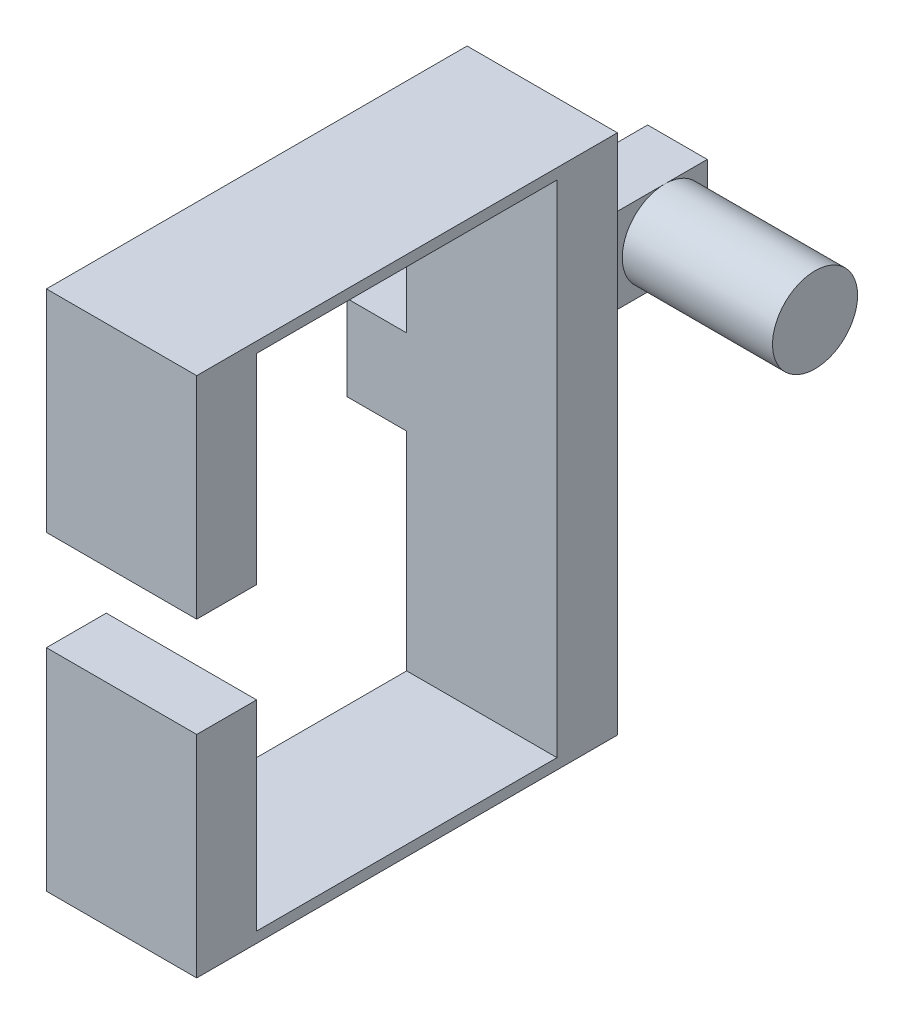
ISO-10303-21;
HEADER;
FILE_DESCRIPTION(('STEP AP214'),'2;1');
FILE_NAME('part.step','',(''),(''),'','','');
FILE_SCHEMA(('AUTOMOTIVE_DESIGN { 1 0 10303 214 1 1 1 1 }'));
ENDSEC;
DATA;
#1=APPLICATION_CONTEXT('core data for automotive mechanical design processes');
#2=APPLICATION_PROTOCOL_DEFINITION('international standard','automotive_design',2000,#1);
#3=PRODUCT_CONTEXT('',#1,'mechanical');
#4=PRODUCT('Part','Part','',(#3));
#5=PRODUCT_RELATED_PRODUCT_CATEGORY('part','',(#4));
#6=PRODUCT_DEFINITION_FORMATION('','',#4);
#7=PRODUCT_DEFINITION_CONTEXT('part definition',#1,'design');
#8=PRODUCT_DEFINITION('design','',#6,#7);
#9=PRODUCT_DEFINITION_SHAPE('','',#8);
#10=(LENGTH_UNIT() NAMED_UNIT(*) SI_UNIT(.MILLI.,.METRE.));
#11=(NAMED_UNIT(*) PLANE_ANGLE_UNIT() SI_UNIT($,.RADIAN.));
#12=(NAMED_UNIT(*) SI_UNIT($,.STERADIAN.) SOLID_ANGLE_UNIT());
#13=UNCERTAINTY_MEASURE_WITH_UNIT(LENGTH_MEASURE(1.E-05),#10,'distance_accuracy_value','');
#14=(GEOMETRIC_REPRESENTATION_CONTEXT(3) GLOBAL_UNCERTAINTY_ASSIGNED_CONTEXT((#13)) GLOBAL_UNIT_ASSIGNED_CONTEXT((#10,
#11,#12)) REPRESENTATION_CONTEXT('',''));
#15=CARTESIAN_POINT('',(0.,0.,0.));
#16=DIRECTION('',(0.,0.,1.));
#17=DIRECTION('',(1.,0.,0.));
#18=AXIS2_PLACEMENT_3D('',#15,#16,#17);
#19=CARTESIAN_POINT('',(0.,0.,0.));
#20=DIRECTION('',(-1.,0.,0.));
#21=DIRECTION('',(0.,0.,1.));
#22=AXIS2_PLACEMENT_3D('',#19,#20,#21);
#23=PLANE('',#22);
#24=CARTESIAN_POINT('',(0.,33.0589466598933,-25.0537044534588));
#25=DIRECTION('',(1.,0.,0.));
#26=DIRECTION('',(0.,0.,-1.));
#27=AXIS2_PLACEMENT_3D('',#24,#25,#26);
#28=CIRCLE('',#27,5.38878483418973);
#29=CARTESIAN_POINT('',(0.,33.0589466598933,-30.4424892876485));
#30=VERTEX_POINT('',#29);
#31=CARTESIAN_POINT('',(0.,38.4477314940831,-25.0537044534588));
#32=VERTEX_POINT('',#31);
#33=EDGE_CURVE('E194',#30,#32,#28,.T.);
#34=ORIENTED_EDGE('',*,*,#33,.F.);
#35=DIRECTION('',(0.,-1.,0.));
#36=VECTOR('',#35,1.);
#37=CARTESIAN_POINT('',(0.,38.4477314940831,-30.4424892876485));
#38=LINE('',#37,#36);
#39=CARTESIAN_POINT('',(0.,38.4477314940831,-30.4424892876485));
#40=VERTEX_POINT('',#39);
#41=EDGE_CURVE('E176',#40,#30,#38,.T.);
#42=ORIENTED_EDGE('',*,*,#41,.F.);
#43=DIRECTION('',(0.,0.,-1.));
#44=VECTOR('',#43,1.);
#45=CARTESIAN_POINT('',(0.,38.4477314940831,7.65751071235147));
#46=LINE('',#45,#44);
#47=EDGE_CURVE('E191',#32,#40,#46,.T.);
#48=ORIENTED_EDGE('',*,*,#47,.F.);
#49=EDGE_LOOP('',(#34,#42,#48));
#50=FACE_BOUND('',#49,.T.);
#51=ADVANCED_FACE('F44',(#50),#23,.F.);
#52=CARTESIAN_POINT('',(0.,27.6701618257036,-25.0537044534588));
#53=VERTEX_POINT('',#52);
#54=EDGE_CURVE('E63',#32,#53,#28,.T.);
#55=ORIENTED_EDGE('',*,*,#54,.F.);
#56=CARTESIAN_POINT('',(0.,38.4477314940831,0.));
#57=VERTEX_POINT('',#56);
#58=EDGE_CURVE('E213',#57,#32,#46,.T.);
#59=ORIENTED_EDGE('',*,*,#58,.F.);
#60=DIRECTION('',(0.,1.,0.));
#61=VECTOR('',#60,1.);
#62=CARTESIAN_POINT('',(0.,0.,0.));
#63=LINE('',#62,#61);
#64=CARTESIAN_POINT('',(0.,27.6701618257036,0.));
#65=VERTEX_POINT('',#64);
#66=EDGE_CURVE('E254',#65,#57,#63,.T.);
#67=ORIENTED_EDGE('',*,*,#66,.F.);
#68=DIRECTION('',(0.,0.,1.));
#69=VECTOR('',#68,1.);
#70=CARTESIAN_POINT('',(0.,27.6701618257036,7.65751071235147));
#71=LINE('',#70,#69);
#72=EDGE_CURVE('E57',#53,#65,#71,.T.);
#73=ORIENTED_EDGE('',*,*,#72,.F.);
#74=EDGE_LOOP('',(#55,#59,#67,#73));
#75=FACE_BOUND('',#74,.T.);
#76=ADVANCED_FACE('F374',(#75),#23,.F.);
#77=CARTESIAN_POINT('',(0.,0.,0.));
#78=DIRECTION('',(1.,0.,0.));
#79=DIRECTION('',(0.,0.,-1.));
#80=AXIS2_PLACEMENT_3D('',#77,#78,#79);
#81=PLANE('',#80);
#82=CARTESIAN_POINT('',(0.,38.4477314940831,7.65751071235147));
#83=VERTEX_POINT('',#82);
#84=EDGE_CURVE('E192',#83,#57,#46,.T.);
#85=ORIENTED_EDGE('',*,*,#84,.F.);
#86=DIRECTION('',(0.,-1.,0.));
#87=VECTOR('',#86,1.);
#88=CARTESIAN_POINT('',(0.,1.35466665989335,7.65751071235147));
#89=LINE('',#88,#87);
#90=CARTESIAN_POINT('',(0.,64.7632266598933,7.65751071235147));
#91=VERTEX_POINT('',#90);
#92=EDGE_CURVE('E266',#91,#83,#89,.T.);
#93=ORIENTED_EDGE('',*,*,#92,.F.);
#94=DIRECTION('',(0.,0.,-1.));
#95=VECTOR('',#94,1.);
#96=CARTESIAN_POINT('',(0.,64.7632266598933,45.7321107123515));
#97=LINE('',#96,#95);
#98=CARTESIAN_POINT('',(0.,64.7632266598933,45.7321107123515));
#99=VERTEX_POINT('',#98);
#100=EDGE_CURVE('E263',#99,#91,#97,.T.);
#101=ORIENTED_EDGE('',*,*,#100,.F.);
#102=DIRECTION('',(0.,1.,0.));
#103=VECTOR('',#102,1.);
#104=CARTESIAN_POINT('',(0.,39.3835466598933,45.7321107123515));
#105=LINE('',#104,#103);
#106=CARTESIAN_POINT('',(0.,39.3835466598933,45.7321107123515));
#107=VERTEX_POINT('',#106);
#108=EDGE_CURVE('E261',#107,#99,#105,.T.);
#109=ORIENTED_EDGE('',*,*,#108,.F.);
#110=DIRECTION('',(0.,0.,-1.));
#111=VECTOR('',#110,1.);
#112=CARTESIAN_POINT('',(0.,39.3835466598933,53.3205661447543));
#113=LINE('',#112,#111);
#114=CARTESIAN_POINT('',(0.,39.3835466598933,53.3205661447543));
#115=VERTEX_POINT('',#114);
#116=EDGE_CURVE('E259',#115,#107,#113,.T.);
#117=ORIENTED_EDGE('',*,*,#116,.F.);
#118=DIRECTION('',(0.,-1.,0.));
#119=VECTOR('',#118,1.);
#120=CARTESIAN_POINT('',(0.,66.1178933197867,53.3205661447543));
#121=LINE('',#120,#119);
#122=CARTESIAN_POINT('',(0.,66.1178933197867,53.3205661447543));
#123=VERTEX_POINT('',#122);
#124=EDGE_CURVE('E260',#123,#115,#121,.T.);
#125=ORIENTED_EDGE('',*,*,#124,.F.);
#126=DIRECTION('',(0.,0.,1.));
#127=VECTOR('',#126,1.);
#128=CARTESIAN_POINT('',(0.,66.1178933197867,0.));
#129=LINE('',#128,#127);
#130=CARTESIAN_POINT('',(0.,66.1178933197867,0.));
#131=VERTEX_POINT('',#130);
#132=EDGE_CURVE('E255',#131,#123,#129,.T.);
#133=ORIENTED_EDGE('',*,*,#132,.F.);
#134=EDGE_CURVE('E224',#57,#131,#63,.T.);
#135=ORIENTED_EDGE('',*,*,#134,.F.);
#136=EDGE_LOOP('',(#85,#93,#101,#109,#117,#125,#133,#135));
#137=FACE_BOUND('',#136,.T.);
#138=ADVANCED_FACE('F325',(#137),#81,.F.);
#139=CARTESIAN_POINT('',(0.,27.6701618257036,7.65751071235147));
#140=VERTEX_POINT('',#139);
#141=EDGE_CURVE('E11',#65,#140,#71,.T.);
#142=ORIENTED_EDGE('',*,*,#141,.F.);
#143=CARTESIAN_POINT('',(0.,0.,0.));
#144=VERTEX_POINT('',#143);
#145=EDGE_CURVE('E253',#144,#65,#63,.T.);
#146=ORIENTED_EDGE('',*,*,#145,.F.);
#147=DIRECTION('',(0.,0.,-1.));
#148=VECTOR('',#147,1.);
#149=CARTESIAN_POINT('',(0.,0.,0.));
#150=LINE('',#149,#148);
#151=CARTESIAN_POINT('',(0.,0.,53.3205661447543));
#152=VERTEX_POINT('',#151);
#153=EDGE_CURVE('E228',#152,#144,#150,.T.);
#154=ORIENTED_EDGE('',*,*,#153,.F.);
#155=DIRECTION('',(0.,-1.,0.));
#156=VECTOR('',#155,1.);
#157=CARTESIAN_POINT('',(0.,0.,53.3205661447543));
#158=LINE('',#157,#156);
#159=CARTESIAN_POINT('',(0.,26.7343466598933,53.3205661447543));
#160=VERTEX_POINT('',#159);
#161=EDGE_CURVE('E274',#160,#152,#158,.T.);
#162=ORIENTED_EDGE('',*,*,#161,.F.);
#163=DIRECTION('',(0.,0.,1.));
#164=VECTOR('',#163,1.);
#165=CARTESIAN_POINT('',(0.,26.7343466598933,53.3205661447543));
#166=LINE('',#165,#164);
#167=CARTESIAN_POINT('',(0.,26.7343466598933,45.7321107123515));
#168=VERTEX_POINT('',#167);
#169=EDGE_CURVE('E272',#168,#160,#166,.T.);
#170=ORIENTED_EDGE('',*,*,#169,.F.);
#171=DIRECTION('',(0.,1.,0.));
#172=VECTOR('',#171,1.);
#173=CARTESIAN_POINT('',(0.,26.7343466598933,45.7321107123515));
#174=LINE('',#173,#172);
#175=CARTESIAN_POINT('',(0.,1.35466665989334,45.7321107123515));
#176=VERTEX_POINT('',#175);
#177=EDGE_CURVE('E271',#176,#168,#174,.T.);
#178=ORIENTED_EDGE('',*,*,#177,.F.);
#179=DIRECTION('',(0.,0.,1.));
#180=VECTOR('',#179,1.);
#181=CARTESIAN_POINT('',(0.,1.35466665989334,45.7321107123515));
#182=LINE('',#181,#180);
#183=CARTESIAN_POINT('',(0.,1.35466665989335,7.65751071235147));
#184=VERTEX_POINT('',#183);
#185=EDGE_CURVE('E267',#184,#176,#182,.T.);
#186=ORIENTED_EDGE('',*,*,#185,.F.);
#187=EDGE_CURVE('E264',#140,#184,#89,.T.);
#188=ORIENTED_EDGE('',*,*,#187,.F.);
#189=EDGE_LOOP('',(#142,#146,#154,#162,#170,#178,#186,#188));
#190=FACE_BOUND('',#189,.T.);
#191=ADVANCED_FACE('F343',(#190),#81,.F.);
#192=CARTESIAN_POINT('',(19.05,0.,0.));
#193=DIRECTION('',(0.,0.,1.));
#194=DIRECTION('',(1.,0.,0.));
#195=AXIS2_PLACEMENT_3D('',#192,#193,#194);
#196=PLANE('',#195);
#197=ORIENTED_EDGE('',*,*,#145,.T.);
#198=ORIENTED_EDGE('',*,*,#66,.T.);
#199=ORIENTED_EDGE('',*,*,#134,.T.);
#200=DIRECTION('',(-1.,0.,0.));
#201=VECTOR('',#200,1.);
#202=CARTESIAN_POINT('',(19.05,66.1178933197867,0.));
#203=LINE('',#202,#201);
#204=CARTESIAN_POINT('',(19.05,66.1178933197867,0.));
#205=VERTEX_POINT('',#204);
#206=EDGE_CURVE('E47',#205,#131,#203,.T.);
#207=ORIENTED_EDGE('',*,*,#206,.F.);
#208=DIRECTION('',(0.,1.,0.));
#209=VECTOR('',#208,1.);
#210=CARTESIAN_POINT('',(19.05,0.,0.));
#211=LINE('',#210,#209);
#212=CARTESIAN_POINT('',(19.05,0.,0.));
#213=VERTEX_POINT('',#212);
#214=EDGE_CURVE('E221',#213,#205,#211,.T.);
#215=ORIENTED_EDGE('',*,*,#214,.F.);
#216=DIRECTION('',(-1.,0.,0.));
#217=VECTOR('',#216,1.);
#218=CARTESIAN_POINT('',(19.05,0.,0.));
#219=LINE('',#218,#217);
#220=EDGE_CURVE('E248',#213,#144,#219,.T.);
#221=ORIENTED_EDGE('',*,*,#220,.T.);
#222=EDGE_LOOP('',(#197,#198,#199,#207,#215,#221));
#223=FACE_BOUND('',#222,.T.);
#224=ADVANCED_FACE('F50',(#223),#196,.F.);
#225=CARTESIAN_POINT('',(19.05,66.1178933197867,0.));
#226=DIRECTION('',(0.,-1.,0.));
#227=DIRECTION('',(0.,0.,-1.));
#228=AXIS2_PLACEMENT_3D('',#225,#226,#227);
#229=PLANE('',#228);
#230=ORIENTED_EDGE('',*,*,#132,.T.);
#231=DIRECTION('',(-1.,0.,0.));
#232=VECTOR('',#231,1.);
#233=CARTESIAN_POINT('',(19.05,66.1178933197867,53.3205661447543));
#234=LINE('',#233,#232);
#235=CARTESIAN_POINT('',(19.05,66.1178933197867,53.3205661447543));
#236=VERTEX_POINT('',#235);
#237=EDGE_CURVE('E308',#236,#123,#234,.T.);
#238=ORIENTED_EDGE('',*,*,#237,.F.);
#239=DIRECTION('',(0.,0.,1.));
#240=VECTOR('',#239,1.);
#241=CARTESIAN_POINT('',(19.05,66.1178933197867,0.));
#242=LINE('',#241,#240);
#243=EDGE_CURVE('E230',#205,#236,#242,.T.);
#244=ORIENTED_EDGE('',*,*,#243,.F.);
#245=ORIENTED_EDGE('',*,*,#206,.T.);
#246=EDGE_LOOP('',(#230,#238,#244,#245));
#247=FACE_BOUND('',#246,.T.);
#248=ADVANCED_FACE('F312',(#247),#229,.F.);
#249=CARTESIAN_POINT('',(19.05,66.1178933197867,53.3205661447543));
#250=DIRECTION('',(0.,0.,-1.));
#251=DIRECTION('',(-1.,0.,0.));
#252=AXIS2_PLACEMENT_3D('',#249,#250,#251);
#253=PLANE('',#252);
#254=ORIENTED_EDGE('',*,*,#124,.T.);
#255=DIRECTION('',(-1.,0.,0.));
#256=VECTOR('',#255,1.);
#257=CARTESIAN_POINT('',(19.05,39.3835466598933,53.3205661447543));
#258=LINE('',#257,#256);
#259=CARTESIAN_POINT('',(19.05,39.3835466598933,53.3205661447543));
#260=VERTEX_POINT('',#259);
#261=EDGE_CURVE('E301',#260,#115,#258,.T.);
#262=ORIENTED_EDGE('',*,*,#261,.F.);
#263=DIRECTION('',(0.,-1.,0.));
#264=VECTOR('',#263,1.);
#265=CARTESIAN_POINT('',(19.05,66.1178933197867,53.3205661447543));
#266=LINE('',#265,#264);
#267=EDGE_CURVE('E226',#236,#260,#266,.T.);
#268=ORIENTED_EDGE('',*,*,#267,.F.);
#269=ORIENTED_EDGE('',*,*,#237,.T.);
#270=EDGE_LOOP('',(#254,#262,#268,#269));
#271=FACE_BOUND('',#270,.T.);
#272=ADVANCED_FACE('F326',(#271),#253,.F.);
#273=CARTESIAN_POINT('',(19.05,39.3835466598933,53.3205661447543));
#274=DIRECTION('',(0.,1.,0.));
#275=DIRECTION('',(0.,0.,1.));
#276=AXIS2_PLACEMENT_3D('',#273,#274,#275);
#277=PLANE('',#276);
#278=ORIENTED_EDGE('',*,*,#116,.T.);
#279=DIRECTION('',(-1.,0.,0.));
#280=VECTOR('',#279,1.);
#281=CARTESIAN_POINT('',(19.05,39.3835466598933,45.7321107123515));
#282=LINE('',#281,#280);
#283=CARTESIAN_POINT('',(19.05,39.3835466598933,45.7321107123515));
#284=VERTEX_POINT('',#283);
#285=EDGE_CURVE('E302',#284,#107,#282,.T.);
#286=ORIENTED_EDGE('',*,*,#285,.F.);
#287=DIRECTION('',(0.,0.,-1.));
#288=VECTOR('',#287,1.);
#289=CARTESIAN_POINT('',(19.05,39.3835466598933,53.3205661447543));
#290=LINE('',#289,#288);
#291=EDGE_CURVE('E235',#260,#284,#290,.T.);
#292=ORIENTED_EDGE('',*,*,#291,.F.);
#293=ORIENTED_EDGE('',*,*,#261,.T.);
#294=EDGE_LOOP('',(#278,#286,#292,#293));
#295=FACE_BOUND('',#294,.T.);
#296=ADVANCED_FACE('F328',(#295),#277,.F.);
#297=CARTESIAN_POINT('',(19.05,39.3835466598933,45.7321107123515));
#298=DIRECTION('',(0.,0.,1.));
#299=DIRECTION('',(1.,0.,0.));
#300=AXIS2_PLACEMENT_3D('',#297,#298,#299);
#301=PLANE('',#300);
#302=ORIENTED_EDGE('',*,*,#108,.T.);
#303=DIRECTION('',(-1.,0.,0.));
#304=VECTOR('',#303,1.);
#305=CARTESIAN_POINT('',(19.05,64.7632266598933,45.7321107123515));
#306=LINE('',#305,#304);
#307=CARTESIAN_POINT('',(19.05,64.7632266598933,45.7321107123515));
#308=VERTEX_POINT('',#307);
#309=EDGE_CURVE('E298',#308,#99,#306,.T.);
#310=ORIENTED_EDGE('',*,*,#309,.F.);
#311=DIRECTION('',(0.,1.,0.));
#312=VECTOR('',#311,1.);
#313=CARTESIAN_POINT('',(19.05,39.3835466598933,45.7321107123515));
#314=LINE('',#313,#312);
#315=EDGE_CURVE('E231',#284,#308,#314,.T.);
#316=ORIENTED_EDGE('',*,*,#315,.F.);
#317=ORIENTED_EDGE('',*,*,#285,.T.);
#318=EDGE_LOOP('',(#302,#310,#316,#317));
#319=FACE_BOUND('',#318,.T.);
#320=ADVANCED_FACE('F418',(#319),#301,.F.);
#321=CARTESIAN_POINT('',(19.05,64.7632266598933,45.7321107123515));
#322=DIRECTION('',(0.,1.,0.));
#323=DIRECTION('',(0.,0.,1.));
#324=AXIS2_PLACEMENT_3D('',#321,#322,#323);
#325=PLANE('',#324);
#326=ORIENTED_EDGE('',*,*,#100,.T.);
#327=DIRECTION('',(-1.,0.,0.));
#328=VECTOR('',#327,1.);
#329=CARTESIAN_POINT('',(19.05,64.7632266598933,7.65751071235147));
#330=LINE('',#329,#328);
#331=CARTESIAN_POINT('',(19.05,64.7632266598933,7.65751071235147));
#332=VERTEX_POINT('',#331);
#333=EDGE_CURVE('E293',#332,#91,#330,.T.);
#334=ORIENTED_EDGE('',*,*,#333,.F.);
#335=DIRECTION('',(0.,0.,-1.));
#336=VECTOR('',#335,1.);
#337=CARTESIAN_POINT('',(19.05,64.7632266598933,45.7321107123515));
#338=LINE('',#337,#336);
#339=EDGE_CURVE('E237',#308,#332,#338,.T.);
#340=ORIENTED_EDGE('',*,*,#339,.F.);
#341=ORIENTED_EDGE('',*,*,#309,.T.);
#342=EDGE_LOOP('',(#326,#334,#340,#341));
#343=FACE_BOUND('',#342,.T.);
#344=ADVANCED_FACE('F414',(#343),#325,.F.);
#345=CARTESIAN_POINT('',(19.05,1.35466665989335,7.65751071235147));
#346=DIRECTION('',(0.,0.,-1.));
#347=DIRECTION('',(-1.,0.,0.));
#348=AXIS2_PLACEMENT_3D('',#345,#346,#347);
#349=PLANE('',#348);
#350=ORIENTED_EDGE('',*,*,#92,.T.);
#351=DIRECTION('',(1.,0.,0.));
#352=VECTOR('',#351,1.);
#353=CARTESIAN_POINT('',(-7.56143527171308,38.4477314940831,7.65751071235147));
#354=LINE('',#353,#352);
#355=CARTESIAN_POINT('',(-7.56143527171308,38.4477314940831,7.65751071235147));
#356=VERTEX_POINT('',#355);
#357=EDGE_CURVE('E211',#356,#83,#354,.T.);
#358=ORIENTED_EDGE('',*,*,#357,.F.);
#359=DIRECTION('',(0.,1.,0.));
#360=VECTOR('',#359,1.);
#361=CARTESIAN_POINT('',(-7.56143527171308,38.4477314940831,7.65751071235147));
#362=LINE('',#361,#360);
#363=CARTESIAN_POINT('',(-7.56143527171308,27.6701618257036,7.65751071235147));
#364=VERTEX_POINT('',#363);
#365=EDGE_CURVE('E207',#364,#356,#362,.T.);
#366=ORIENTED_EDGE('',*,*,#365,.F.);
#367=DIRECTION('',(1.,0.,0.));
#368=VECTOR('',#367,1.);
#369=CARTESIAN_POINT('',(-7.56143527171308,27.6701618257036,7.65751071235147));
#370=LINE('',#369,#368);
#371=EDGE_CURVE('E220',#364,#140,#370,.T.);
#372=ORIENTED_EDGE('',*,*,#371,.T.);
#373=ORIENTED_EDGE('',*,*,#187,.T.);
#374=DIRECTION('',(-1.,0.,0.));
#375=VECTOR('',#374,1.);
#376=CARTESIAN_POINT('',(19.05,1.35466665989335,7.65751071235147));
#377=LINE('',#376,#375);
#378=CARTESIAN_POINT('',(19.05,1.35466665989335,7.65751071235147));
#379=VERTEX_POINT('',#378);
#380=EDGE_CURVE('E295',#379,#184,#377,.T.);
#381=ORIENTED_EDGE('',*,*,#380,.F.);
#382=DIRECTION('',(0.,-1.,0.));
#383=VECTOR('',#382,1.);
#384=CARTESIAN_POINT('',(19.05,1.35466665989335,7.65751071235147));
#385=LINE('',#384,#383);
#386=EDGE_CURVE('E236',#332,#379,#385,.T.);
#387=ORIENTED_EDGE('',*,*,#386,.F.);
#388=ORIENTED_EDGE('',*,*,#333,.T.);
#389=EDGE_LOOP('',(#350,#358,#366,#372,#373,#381,#387,#388));
#390=FACE_BOUND('',#389,.T.);
#391=ADVANCED_FACE('F354',(#390),#349,.F.);
#392=CARTESIAN_POINT('',(19.05,1.35466665989334,45.7321107123515));
#393=DIRECTION('',(0.,-1.,0.));
#394=DIRECTION('',(0.,0.,-1.));
#395=AXIS2_PLACEMENT_3D('',#392,#393,#394);
#396=PLANE('',#395);
#397=ORIENTED_EDGE('',*,*,#185,.T.);
#398=DIRECTION('',(-1.,0.,0.));
#399=VECTOR('',#398,1.);
#400=CARTESIAN_POINT('',(19.05,1.35466665989334,45.7321107123515));
#401=LINE('',#400,#399);
#402=CARTESIAN_POINT('',(19.05,1.35466665989334,45.7321107123515));
#403=VERTEX_POINT('',#402);
#404=EDGE_CURVE('E286',#403,#176,#401,.T.);
#405=ORIENTED_EDGE('',*,*,#404,.F.);
#406=DIRECTION('',(0.,0.,1.));
#407=VECTOR('',#406,1.);
#408=CARTESIAN_POINT('',(19.05,1.35466665989334,45.7321107123515));
#409=LINE('',#408,#407);
#410=EDGE_CURVE('E238',#379,#403,#409,.T.);
#411=ORIENTED_EDGE('',*,*,#410,.F.);
#412=ORIENTED_EDGE('',*,*,#380,.T.);
#413=EDGE_LOOP('',(#397,#405,#411,#412));
#414=FACE_BOUND('',#413,.T.);
#415=ADVANCED_FACE('F407',(#414),#396,.F.);
#416=CARTESIAN_POINT('',(19.05,26.7343466598933,45.7321107123515));
#417=DIRECTION('',(0.,0.,1.));
#418=DIRECTION('',(1.,0.,0.));
#419=AXIS2_PLACEMENT_3D('',#416,#417,#418);
#420=PLANE('',#419);
#421=ORIENTED_EDGE('',*,*,#177,.T.);
#422=DIRECTION('',(-1.,0.,0.));
#423=VECTOR('',#422,1.);
#424=CARTESIAN_POINT('',(19.05,26.7343466598933,45.7321107123515));
#425=LINE('',#424,#423);
#426=CARTESIAN_POINT('',(19.05,26.7343466598933,45.7321107123515));
#427=VERTEX_POINT('',#426);
#428=EDGE_CURVE('E287',#427,#168,#425,.T.);
#429=ORIENTED_EDGE('',*,*,#428,.F.);
#430=DIRECTION('',(0.,1.,0.));
#431=VECTOR('',#430,1.);
#432=CARTESIAN_POINT('',(19.05,26.7343466598933,45.7321107123515));
#433=LINE('',#432,#431);
#434=EDGE_CURVE('E245',#403,#427,#433,.T.);
#435=ORIENTED_EDGE('',*,*,#434,.F.);
#436=ORIENTED_EDGE('',*,*,#404,.T.);
#437=EDGE_LOOP('',(#421,#429,#435,#436));
#438=FACE_BOUND('',#437,.T.);
#439=ADVANCED_FACE('F405',(#438),#420,.F.);
#440=CARTESIAN_POINT('',(19.05,26.7343466598933,53.3205661447543));
#441=DIRECTION('',(0.,-1.,0.));
#442=DIRECTION('',(0.,0.,-1.));
#443=AXIS2_PLACEMENT_3D('',#440,#441,#442);
#444=PLANE('',#443);
#445=ORIENTED_EDGE('',*,*,#169,.T.);
#446=DIRECTION('',(-1.,0.,0.));
#447=VECTOR('',#446,1.);
#448=CARTESIAN_POINT('',(19.05,26.7343466598933,53.3205661447543));
#449=LINE('',#448,#447);
#450=CARTESIAN_POINT('',(19.05,26.7343466598933,53.3205661447543));
#451=VERTEX_POINT('',#450);
#452=EDGE_CURVE('E283',#451,#160,#449,.T.);
#453=ORIENTED_EDGE('',*,*,#452,.F.);
#454=DIRECTION('',(0.,0.,1.));
#455=VECTOR('',#454,1.);
#456=CARTESIAN_POINT('',(19.05,26.7343466598933,53.3205661447543));
#457=LINE('',#456,#455);
#458=EDGE_CURVE('E244',#427,#451,#457,.T.);
#459=ORIENTED_EDGE('',*,*,#458,.F.);
#460=ORIENTED_EDGE('',*,*,#428,.T.);
#461=EDGE_LOOP('',(#445,#453,#459,#460));
#462=FACE_BOUND('',#461,.T.);
#463=ADVANCED_FACE('F399',(#462),#444,.F.);
#464=CARTESIAN_POINT('',(19.05,0.,53.3205661447543));
#465=DIRECTION('',(0.,0.,-1.));
#466=DIRECTION('',(-1.,0.,0.));
#467=AXIS2_PLACEMENT_3D('',#464,#465,#466);
#468=PLANE('',#467);
#469=ORIENTED_EDGE('',*,*,#161,.T.);
#470=DIRECTION('',(-1.,0.,0.));
#471=VECTOR('',#470,1.);
#472=CARTESIAN_POINT('',(19.05,0.,53.3205661447543));
#473=LINE('',#472,#471);
#474=CARTESIAN_POINT('',(19.05,0.,53.3205661447543));
#475=VERTEX_POINT('',#474);
#476=EDGE_CURVE('E278',#475,#152,#473,.T.);
#477=ORIENTED_EDGE('',*,*,#476,.F.);
#478=DIRECTION('',(0.,-1.,0.));
#479=VECTOR('',#478,1.);
#480=CARTESIAN_POINT('',(19.05,0.,53.3205661447543));
#481=LINE('',#480,#479);
#482=EDGE_CURVE('E247',#451,#475,#481,.T.);
#483=ORIENTED_EDGE('',*,*,#482,.F.);
#484=ORIENTED_EDGE('',*,*,#452,.T.);
#485=EDGE_LOOP('',(#469,#477,#483,#484));
#486=FACE_BOUND('',#485,.T.);
#487=ADVANCED_FACE('F391',(#486),#468,.F.);
#488=CARTESIAN_POINT('',(19.05,0.,0.));
#489=DIRECTION('',(0.,1.,0.));
#490=DIRECTION('',(0.,0.,1.));
#491=AXIS2_PLACEMENT_3D('',#488,#489,#490);
#492=PLANE('',#491);
#493=ORIENTED_EDGE('',*,*,#153,.T.);
#494=ORIENTED_EDGE('',*,*,#220,.F.);
#495=DIRECTION('',(0.,0.,-1.));
#496=VECTOR('',#495,1.);
#497=CARTESIAN_POINT('',(19.05,0.,0.));
#498=LINE('',#497,#496);
#499=EDGE_CURVE('E249',#475,#213,#498,.T.);
#500=ORIENTED_EDGE('',*,*,#499,.F.);
#501=ORIENTED_EDGE('',*,*,#476,.T.);
#502=EDGE_LOOP('',(#493,#494,#500,#501));
#503=FACE_BOUND('',#502,.T.);
#504=ADVANCED_FACE('F336',(#503),#492,.F.);
#505=CARTESIAN_POINT('',(19.05,0.,0.));
#506=DIRECTION('',(1.,0.,0.));
#507=DIRECTION('',(0.,0.,-1.));
#508=AXIS2_PLACEMENT_3D('',#505,#506,#507);
#509=PLANE('',#508);
#510=ORIENTED_EDGE('',*,*,#214,.T.);
#511=ORIENTED_EDGE('',*,*,#243,.T.);
#512=ORIENTED_EDGE('',*,*,#267,.T.);
#513=ORIENTED_EDGE('',*,*,#291,.T.);
#514=ORIENTED_EDGE('',*,*,#315,.T.);
#515=ORIENTED_EDGE('',*,*,#339,.T.);
#516=ORIENTED_EDGE('',*,*,#386,.T.);
#517=ORIENTED_EDGE('',*,*,#410,.T.);
#518=ORIENTED_EDGE('',*,*,#434,.T.);
#519=ORIENTED_EDGE('',*,*,#458,.T.);
#520=ORIENTED_EDGE('',*,*,#482,.T.);
#521=ORIENTED_EDGE('',*,*,#499,.T.);
#522=EDGE_LOOP('',(#510,#511,#512,#513,#514,#515,#516,#517,#518,#519,#520,#521));
#523=FACE_BOUND('',#522,.T.);
#524=ADVANCED_FACE('F334',(#523),#509,.T.);
#525=CARTESIAN_POINT('',(-7.56143527171308,38.4477314940831,7.65751071235147));
#526=DIRECTION('',(0.,-1.,0.));
#527=DIRECTION('',(0.,0.,-1.));
#528=AXIS2_PLACEMENT_3D('',#525,#526,#527);
#529=PLANE('',#528);
#530=ORIENTED_EDGE('',*,*,#84,.T.);
#531=ORIENTED_EDGE('',*,*,#58,.T.);
#532=ORIENTED_EDGE('',*,*,#47,.T.);
#533=DIRECTION('',(1.,0.,0.));
#534=VECTOR('',#533,1.);
#535=CARTESIAN_POINT('',(-7.56143527171308,38.4477314940831,-30.4424892876485));
#536=LINE('',#535,#534);
#537=CARTESIAN_POINT('',(-7.56143527171308,38.4477314940831,-30.4424892876485));
#538=VERTEX_POINT('',#537);
#539=EDGE_CURVE('E183',#538,#40,#536,.T.);
#540=ORIENTED_EDGE('',*,*,#539,.F.);
#541=DIRECTION('',(0.,0.,-1.));
#542=VECTOR('',#541,1.);
#543=CARTESIAN_POINT('',(-7.56143527171308,38.4477314940831,7.65751071235147));
#544=LINE('',#543,#542);
#545=EDGE_CURVE('E205',#356,#538,#544,.T.);
#546=ORIENTED_EDGE('',*,*,#545,.F.);
#547=ORIENTED_EDGE('',*,*,#357,.T.);
#548=EDGE_LOOP('',(#530,#531,#532,#540,#546,#547));
#549=FACE_BOUND('',#548,.T.);
#550=ADVANCED_FACE('F363',(#549),#529,.F.);
#551=CARTESIAN_POINT('',(-7.56143527171308,38.4477314940831,-30.4424892876485));
#552=DIRECTION('',(0.,0.,1.));
#553=DIRECTION('',(1.,0.,0.));
#554=AXIS2_PLACEMENT_3D('',#551,#552,#553);
#555=PLANE('',#554);
#556=ORIENTED_EDGE('',*,*,#41,.T.);
#557=CARTESIAN_POINT('',(0.,27.6701618257036,-30.4424892876485));
#558=VERTEX_POINT('',#557);
#559=EDGE_CURVE('E185',#30,#558,#38,.T.);
#560=ORIENTED_EDGE('',*,*,#559,.T.);
#561=DIRECTION('',(1.,0.,0.));
#562=VECTOR('',#561,1.);
#563=CARTESIAN_POINT('',(-7.56143527171308,27.6701618257036,-30.4424892876485));
#564=LINE('',#563,#562);
#565=CARTESIAN_POINT('',(-7.56143527171308,27.6701618257036,-30.4424892876485));
#566=VERTEX_POINT('',#565);
#567=EDGE_CURVE('E219',#566,#558,#564,.T.);
#568=ORIENTED_EDGE('',*,*,#567,.F.);
#569=DIRECTION('',(0.,-1.,0.));
#570=VECTOR('',#569,1.);
#571=CARTESIAN_POINT('',(-7.56143527171308,38.4477314940831,-30.4424892876485));
#572=LINE('',#571,#570);
#573=EDGE_CURVE('E202',#538,#566,#572,.T.);
#574=ORIENTED_EDGE('',*,*,#573,.F.);
#575=ORIENTED_EDGE('',*,*,#539,.T.);
#576=EDGE_LOOP('',(#556,#560,#568,#574,#575));
#577=FACE_BOUND('',#576,.T.);
#578=ADVANCED_FACE('F178',(#577),#555,.F.);
#579=CARTESIAN_POINT('',(-7.56143527171308,27.6701618257036,7.65751071235147));
#580=DIRECTION('',(0.,1.,0.));
#581=DIRECTION('',(0.,0.,1.));
#582=AXIS2_PLACEMENT_3D('',#579,#580,#581);
#583=PLANE('',#582);
#584=EDGE_CURVE('E54',#558,#53,#71,.T.);
#585=ORIENTED_EDGE('',*,*,#584,.T.);
#586=ORIENTED_EDGE('',*,*,#72,.T.);
#587=ORIENTED_EDGE('',*,*,#141,.T.);
#588=ORIENTED_EDGE('',*,*,#371,.F.);
#589=DIRECTION('',(0.,0.,1.));
#590=VECTOR('',#589,1.);
#591=CARTESIAN_POINT('',(-7.56143527171308,27.6701618257036,7.65751071235147));
#592=LINE('',#591,#590);
#593=EDGE_CURVE('E210',#566,#364,#592,.T.);
#594=ORIENTED_EDGE('',*,*,#593,.F.);
#595=ORIENTED_EDGE('',*,*,#567,.T.);
#596=EDGE_LOOP('',(#585,#586,#587,#588,#594,#595));
#597=FACE_BOUND('',#596,.T.);
#598=ADVANCED_FACE('F348',(#597),#583,.F.);
#599=CARTESIAN_POINT('',(-7.56143527171308,0.,0.));
#600=DIRECTION('',(-1.,0.,0.));
#601=DIRECTION('',(0.,0.,1.));
#602=AXIS2_PLACEMENT_3D('',#599,#600,#601);
#603=PLANE('',#602);
#604=ORIENTED_EDGE('',*,*,#545,.T.);
#605=ORIENTED_EDGE('',*,*,#573,.T.);
#606=ORIENTED_EDGE('',*,*,#593,.T.);
#607=ORIENTED_EDGE('',*,*,#365,.T.);
#608=EDGE_LOOP('',(#604,#605,#606,#607));
#609=FACE_BOUND('',#608,.T.);
#610=ADVANCED_FACE('F356',(#609),#603,.T.);
#611=EDGE_CURVE('E72',#53,#30,#28,.T.);
#612=ORIENTED_EDGE('',*,*,#611,.F.);
#613=ORIENTED_EDGE('',*,*,#584,.F.);
#614=ORIENTED_EDGE('',*,*,#559,.F.);
#615=EDGE_LOOP('',(#612,#613,#614));
#616=FACE_BOUND('',#615,.T.);
#617=ADVANCED_FACE('F189',(#616),#23,.F.);
#618=CARTESIAN_POINT('',(19.05,33.0589466598933,-25.0537044534588));
#619=DIRECTION('',(-1.,0.,0.));
#620=DIRECTION('',(0.,0.,1.));
#621=AXIS2_PLACEMENT_3D('',#618,#619,#620);
#622=CYLINDRICAL_SURFACE('',#621,5.38878483418973);
#623=CARTESIAN_POINT('',(19.05,33.0589466598933,-25.0537044534588));
#624=DIRECTION('',(1.,0.,0.));
#625=DIRECTION('',(0.,0.,-1.));
#626=AXIS2_PLACEMENT_3D('',#623,#624,#625);
#627=CIRCLE('',#626,5.38878483418973);
#628=CARTESIAN_POINT('',(19.05,33.0589466598933,-30.4424892876485));
#629=VERTEX_POINT('',#628);
#630=EDGE_CURVE('E197',#629,#629,#627,.T.);
#631=ORIENTED_EDGE('',*,*,#630,.F.);
#632=EDGE_LOOP('',(#631));
#633=FACE_BOUND('',#632,.T.);
#634=ORIENTED_EDGE('',*,*,#33,.T.);
#635=ORIENTED_EDGE('',*,*,#54,.T.);
#636=ORIENTED_EDGE('',*,*,#611,.T.);
#637=EDGE_LOOP('',(#634,#635,#636));
#638=FACE_BOUND('',#637,.T.);
#639=ADVANCED_FACE('F200',(#633,#638),#622,.T.);
#640=CARTESIAN_POINT('',(19.05,33.0589466598933,-25.0537044534588));
#641=DIRECTION('',(1.,0.,0.));
#642=DIRECTION('',(0.,0.,-1.));
#643=AXIS2_PLACEMENT_3D('',#640,#641,#642);
#644=PLANE('',#643);
#645=ORIENTED_EDGE('',*,*,#630,.T.);
#646=EDGE_LOOP('',(#645));
#647=FACE_BOUND('',#646,.T.);
#648=ADVANCED_FACE('F364',(#647),#644,.T.);
#649=CLOSED_SHELL('',(#51,#76,#138,#191,#224,#248,#272,#296,#320,#344,#391,#415,#439,#463,#487,
#504,#524,#550,#578,#598,#610,#617,#639,#648));
#650=MANIFOLD_SOLID_BREP('B2',#649);
#651=ADVANCED_BREP_SHAPE_REPRESENTATION('',(#18,#650),#14);
#652=SHAPE_DEFINITION_REPRESENTATION(#9,#651);
ENDSEC;
END-ISO-10303-21;
